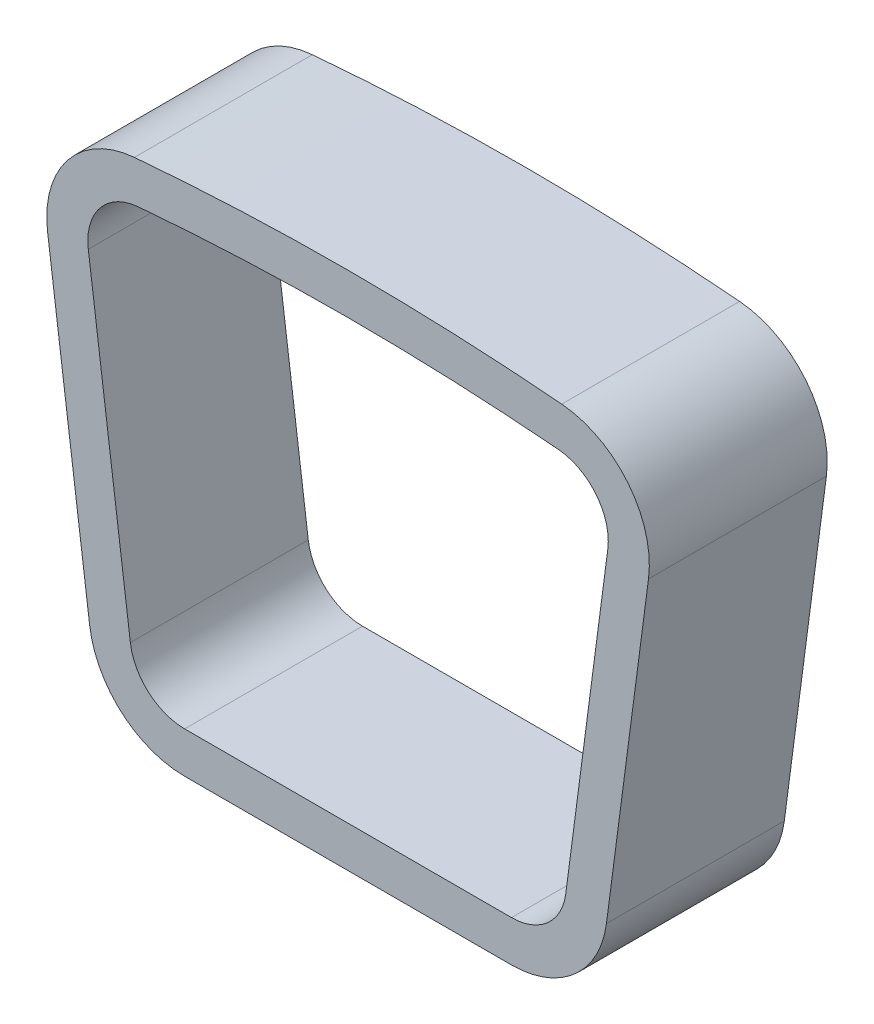
ISO-10303-21;
HEADER;
FILE_DESCRIPTION(('STEP AP214'),'2;1');
FILE_NAME('part.step','',(''),(''),'','','');
FILE_SCHEMA(('AUTOMOTIVE_DESIGN { 1 0 10303 214 1 1 1 1 }'));
ENDSEC;
DATA;
#1=APPLICATION_CONTEXT('core data for automotive mechanical design processes');
#2=APPLICATION_PROTOCOL_DEFINITION('international standard','automotive_design',2000,#1);
#3=PRODUCT_CONTEXT('',#1,'mechanical');
#4=PRODUCT('Part','Part','',(#3));
#5=PRODUCT_RELATED_PRODUCT_CATEGORY('part','',(#4));
#6=PRODUCT_DEFINITION_FORMATION('','',#4);
#7=PRODUCT_DEFINITION_CONTEXT('part definition',#1,'design');
#8=PRODUCT_DEFINITION('design','',#6,#7);
#9=PRODUCT_DEFINITION_SHAPE('','',#8);
#10=(LENGTH_UNIT() NAMED_UNIT(*) SI_UNIT(.MILLI.,.METRE.));
#11=(NAMED_UNIT(*) PLANE_ANGLE_UNIT() SI_UNIT($,.RADIAN.));
#12=(NAMED_UNIT(*) SI_UNIT($,.STERADIAN.) SOLID_ANGLE_UNIT());
#13=UNCERTAINTY_MEASURE_WITH_UNIT(LENGTH_MEASURE(1.E-05),#10,'distance_accuracy_value','');
#14=(GEOMETRIC_REPRESENTATION_CONTEXT(3) GLOBAL_UNCERTAINTY_ASSIGNED_CONTEXT((#13)) GLOBAL_UNIT_ASSIGNED_CONTEXT((#10,
#11,#12)) REPRESENTATION_CONTEXT('',''));
#15=CARTESIAN_POINT('',(0.,0.,0.));
#16=DIRECTION('',(0.,0.,1.));
#17=DIRECTION('',(1.,0.,0.));
#18=AXIS2_PLACEMENT_3D('',#15,#16,#17);
#19=CARTESIAN_POINT('',(-5.97107397432152,72.5,35.5819839661598));
#20=DIRECTION('',(0.,1.,0.));
#21=DIRECTION('',(-1.,0.,0.));
#22=AXIS2_PLACEMENT_3D('',#19,#20,#21);
#23=PLANE('',#22);
#24=DIRECTION('',(1.,0.,0.));
#25=VECTOR('',#24,1.);
#26=CARTESIAN_POINT('',(-5.97107397432152,72.5,6.49999999999999));
#27=LINE('',#26,#25);
#28=CARTESIAN_POINT('',(-5.97107397432152,72.5,6.5));
#29=VERTEX_POINT('',#28);
#30=CARTESIAN_POINT('',(5.97107397432167,72.5,6.49999999999999));
#31=VERTEX_POINT('',#30);
#32=EDGE_CURVE('E312',#29,#31,#27,.T.);
#33=ORIENTED_EDGE('',*,*,#32,.F.);
#34=DIRECTION('',(0.,0.,-1.));
#35=VECTOR('',#34,1.);
#36=CARTESIAN_POINT('',(-5.97107397432152,72.5,35.5819839661598));
#37=LINE('',#36,#35);
#38=CARTESIAN_POINT('',(-5.97107397432152,72.5,0.));
#39=VERTEX_POINT('',#38);
#40=EDGE_CURVE('E56',#29,#39,#37,.T.);
#41=ORIENTED_EDGE('',*,*,#40,.T.);
#42=DIRECTION('',(1.,0.,0.));
#43=VECTOR('',#42,1.);
#44=CARTESIAN_POINT('',(-5.97107397432152,72.5,0.));
#45=LINE('',#44,#43);
#46=CARTESIAN_POINT('',(5.97107397432167,72.5,0.));
#47=VERTEX_POINT('',#46);
#48=EDGE_CURVE('E207',#39,#47,#45,.T.);
#49=ORIENTED_EDGE('',*,*,#48,.T.);
#50=DIRECTION('',(0.,0.,-1.));
#51=VECTOR('',#50,1.);
#52=CARTESIAN_POINT('',(5.97107397432167,72.5,35.5819839661598));
#53=LINE('',#52,#51);
#54=EDGE_CURVE('E210',#31,#47,#53,.T.);
#55=ORIENTED_EDGE('',*,*,#54,.F.);
#56=EDGE_LOOP('',(#33,#41,#49,#55));
#57=FACE_BOUND('',#56,.T.);
#58=ADVANCED_FACE('F41',(#57),#23,.F.);
#59=CARTESIAN_POINT('',(-5.97107397432152,76.,35.5819839661598));
#60=DIRECTION('',(0.,0.,-1.));
#61=DIRECTION('',(-1.,0.,0.));
#62=AXIS2_PLACEMENT_3D('',#59,#60,#61);
#63=CYLINDRICAL_SURFACE('',#62,3.49999999999999);
#64=CARTESIAN_POINT('',(-5.97107397432152,76.,6.49999999999999));
#65=DIRECTION('',(0.,0.,1.));
#66=DIRECTION('',(1.,0.,0.));
#67=AXIS2_PLACEMENT_3D('',#64,#65,#66);
#68=CIRCLE('',#67,3.49999999999999);
#69=CARTESIAN_POINT('',(-9.44113098912984,75.5431583272298,6.5));
#70=VERTEX_POINT('',#69);
#71=EDGE_CURVE('E248',#70,#29,#68,.T.);
#72=ORIENTED_EDGE('',*,*,#71,.F.);
#73=DIRECTION('',(0.,0.,-1.));
#74=VECTOR('',#73,1.);
#75=CARTESIAN_POINT('',(-9.44113098912984,75.5431583272298,35.5819839661598));
#76=LINE('',#75,#74);
#77=CARTESIAN_POINT('',(-9.44113098912984,75.5431583272298,0.));
#78=VERTEX_POINT('',#77);
#79=EDGE_CURVE('E213',#70,#78,#76,.T.);
#80=ORIENTED_EDGE('',*,*,#79,.T.);
#81=CARTESIAN_POINT('',(-5.97107397432152,76.,0.));
#82=DIRECTION('',(0.,0.,1.));
#83=DIRECTION('',(1.,0.,0.));
#84=AXIS2_PLACEMENT_3D('',#81,#82,#83);
#85=CIRCLE('',#84,3.49999999999999);
#86=EDGE_CURVE('E205',#78,#39,#85,.T.);
#87=ORIENTED_EDGE('',*,*,#86,.T.);
#88=ORIENTED_EDGE('',*,*,#40,.F.);
#89=EDGE_LOOP('',(#72,#80,#87,#88));
#90=FACE_BOUND('',#89,.T.);
#91=ADVANCED_FACE('F245',(#90),#63,.T.);
#92=CARTESIAN_POINT('',(-10.978710331722,87.2222329423648,35.5819839661598));
#93=DIRECTION('',(0.99144486137381,0.130526192220056,0.));
#94=DIRECTION('',(-0.130526192220056,0.99144486137381,0.));
#95=AXIS2_PLACEMENT_3D('',#92,#93,#94);
#96=PLANE('',#95);
#97=DIRECTION('',(0.130526192220056,-0.99144486137381,0.));
#98=VECTOR('',#97,1.);
#99=CARTESIAN_POINT('',(-10.978710331722,87.2222329423648,6.49999999999999));
#100=LINE('',#99,#98);
#101=CARTESIAN_POINT('',(-10.978710331722,87.2222329423648,6.5));
#102=VERTEX_POINT('',#101);
#103=EDGE_CURVE('E253',#102,#70,#100,.T.);
#104=ORIENTED_EDGE('',*,*,#103,.F.);
#105=DIRECTION('',(0.,0.,-1.));
#106=VECTOR('',#105,1.);
#107=CARTESIAN_POINT('',(-10.978710331722,87.2222329423648,35.5819839661598));
#108=LINE('',#107,#106);
#109=CARTESIAN_POINT('',(-10.978710331722,87.2222329423648,0.));
#110=VERTEX_POINT('',#109);
#111=EDGE_CURVE('E215',#102,#110,#108,.T.);
#112=ORIENTED_EDGE('',*,*,#111,.T.);
#113=DIRECTION('',(0.130526192220056,-0.99144486137381,0.));
#114=VECTOR('',#113,1.);
#115=CARTESIAN_POINT('',(-10.978710331722,87.2222329423648,0.));
#116=LINE('',#115,#114);
#117=EDGE_CURVE('E202',#110,#78,#116,.T.);
#118=ORIENTED_EDGE('',*,*,#117,.T.);
#119=ORIENTED_EDGE('',*,*,#79,.F.);
#120=EDGE_LOOP('',(#104,#112,#118,#119));
#121=FACE_BOUND('',#120,.T.);
#122=ADVANCED_FACE('F251',(#121),#96,.F.);
#123=CARTESIAN_POINT('',(-7.50865331691368,87.679074615135,35.5819839661598));
#124=DIRECTION('',(0.,0.,-1.));
#125=DIRECTION('',(-1.,0.,0.));
#126=AXIS2_PLACEMENT_3D('',#123,#124,#125);
#127=CYLINDRICAL_SURFACE('',#126,3.49999999999998);
#128=CARTESIAN_POINT('',(-7.50865331691368,87.679074615135,6.49999999999999));
#129=DIRECTION('',(0.,0.,1.));
#130=DIRECTION('',(1.,0.,0.));
#131=AXIS2_PLACEMENT_3D('',#128,#129,#130);
#132=CIRCLE('',#131,3.49999999999998);
#133=CARTESIAN_POINT('',(-7.80729293747274,91.1663105373278,6.5));
#134=VERTEX_POINT('',#133);
#135=EDGE_CURVE('E316',#134,#102,#132,.T.);
#136=ORIENTED_EDGE('',*,*,#135,.F.);
#137=DIRECTION('',(0.,0.,-1.));
#138=VECTOR('',#137,1.);
#139=CARTESIAN_POINT('',(-7.80729293747274,91.1663105373278,35.5819839661598));
#140=LINE('',#139,#138);
#141=CARTESIAN_POINT('',(-7.80729293747274,91.1663105373278,0.));
#142=VERTEX_POINT('',#141);
#143=EDGE_CURVE('E217',#134,#142,#140,.T.);
#144=ORIENTED_EDGE('',*,*,#143,.T.);
#145=CARTESIAN_POINT('',(-7.50865331691368,87.679074615135,0.));
#146=DIRECTION('',(0.,0.,1.));
#147=DIRECTION('',(1.,0.,0.));
#148=AXIS2_PLACEMENT_3D('',#145,#146,#147);
#149=CIRCLE('',#148,3.49999999999998);
#150=EDGE_CURVE('E199',#142,#110,#149,.T.);
#151=ORIENTED_EDGE('',*,*,#150,.T.);
#152=ORIENTED_EDGE('',*,*,#111,.F.);
#153=EDGE_LOOP('',(#136,#144,#151,#152));
#154=FACE_BOUND('',#153,.T.);
#155=ADVANCED_FACE('F256',(#154),#127,.T.);
#156=CARTESIAN_POINT('',(0.,0.,35.5819839661598));
#157=DIRECTION('',(0.,0.,-1.));
#158=DIRECTION('',(-1.,0.,0.));
#159=AXIS2_PLACEMENT_3D('',#156,#157,#158);
#160=CYLINDRICAL_SURFACE('',#159,91.5);
#161=CARTESIAN_POINT('',(0.,0.,6.49999999999999));
#162=DIRECTION('',(0.,0.,1.));
#163=DIRECTION('',(1.,0.,0.));
#164=AXIS2_PLACEMENT_3D('',#161,#162,#163);
#165=CIRCLE('',#164,91.5);
#166=CARTESIAN_POINT('',(7.80729293747267,91.1663105373278,6.5));
#167=VERTEX_POINT('',#166);
#168=EDGE_CURVE('E262',#167,#134,#165,.T.);
#169=ORIENTED_EDGE('',*,*,#168,.F.);
#170=DIRECTION('',(0.,0.,-1.));
#171=VECTOR('',#170,1.);
#172=CARTESIAN_POINT('',(7.80729293747267,91.1663105373278,35.5819839661598));
#173=LINE('',#172,#171);
#174=CARTESIAN_POINT('',(7.80729293747267,91.1663105373278,0.));
#175=VERTEX_POINT('',#174);
#176=EDGE_CURVE('E219',#167,#175,#173,.T.);
#177=ORIENTED_EDGE('',*,*,#176,.T.);
#178=CARTESIAN_POINT('',(0.,0.,0.));
#179=DIRECTION('',(0.,0.,1.));
#180=DIRECTION('',(1.,0.,0.));
#181=AXIS2_PLACEMENT_3D('',#178,#179,#180);
#182=CIRCLE('',#181,91.5);
#183=EDGE_CURVE('E196',#175,#142,#182,.T.);
#184=ORIENTED_EDGE('',*,*,#183,.T.);
#185=ORIENTED_EDGE('',*,*,#143,.F.);
#186=EDGE_LOOP('',(#169,#177,#184,#185));
#187=FACE_BOUND('',#186,.T.);
#188=ADVANCED_FACE('F259',(#187),#160,.T.);
#189=CARTESIAN_POINT('',(7.5086533169136,87.679074615135,35.5819839661598));
#190=DIRECTION('',(0.,0.,-1.));
#191=DIRECTION('',(-1.,0.,0.));
#192=AXIS2_PLACEMENT_3D('',#189,#190,#191);
#193=CYLINDRICAL_SURFACE('',#192,3.49999999999998);
#194=CARTESIAN_POINT('',(7.5086533169136,87.679074615135,6.49999999999999));
#195=DIRECTION('',(0.,0.,1.));
#196=DIRECTION('',(1.,0.,0.));
#197=AXIS2_PLACEMENT_3D('',#194,#195,#196);
#198=CIRCLE('',#197,3.49999999999998);
#199=CARTESIAN_POINT('',(10.9787103317219,87.2222329423648,6.5));
#200=VERTEX_POINT('',#199);
#201=EDGE_CURVE('E266',#200,#167,#198,.T.);
#202=ORIENTED_EDGE('',*,*,#201,.F.);
#203=DIRECTION('',(0.,0.,-1.));
#204=VECTOR('',#203,1.);
#205=CARTESIAN_POINT('',(10.9787103317219,87.2222329423648,35.5819839661598));
#206=LINE('',#205,#204);
#207=CARTESIAN_POINT('',(10.9787103317219,87.2222329423648,0.));
#208=VERTEX_POINT('',#207);
#209=EDGE_CURVE('E221',#200,#208,#206,.T.);
#210=ORIENTED_EDGE('',*,*,#209,.T.);
#211=CARTESIAN_POINT('',(7.5086533169136,87.679074615135,0.));
#212=DIRECTION('',(0.,0.,1.));
#213=DIRECTION('',(1.,0.,0.));
#214=AXIS2_PLACEMENT_3D('',#211,#212,#213);
#215=CIRCLE('',#214,3.49999999999998);
#216=EDGE_CURVE('E193',#208,#175,#215,.T.);
#217=ORIENTED_EDGE('',*,*,#216,.T.);
#218=ORIENTED_EDGE('',*,*,#176,.F.);
#219=EDGE_LOOP('',(#202,#210,#217,#218));
#220=FACE_BOUND('',#219,.T.);
#221=ADVANCED_FACE('F265',(#220),#193,.T.);
#222=CARTESIAN_POINT('',(9.44113098912986,75.5431583272299,35.5819839661598));
#223=DIRECTION('',(-0.99144486137381,0.130526192220051,0.));
#224=DIRECTION('',(-0.130526192220051,-0.991444861373811,0.));
#225=AXIS2_PLACEMENT_3D('',#222,#223,#224);
#226=PLANE('',#225);
#227=DIRECTION('',(0.130526192220051,0.991444861373811,0.));
#228=VECTOR('',#227,1.);
#229=CARTESIAN_POINT('',(9.44113098912986,75.5431583272299,6.49999999999999));
#230=LINE('',#229,#228);
#231=CARTESIAN_POINT('',(9.44113098912986,75.5431583272299,6.5));
#232=VERTEX_POINT('',#231);
#233=EDGE_CURVE('E229',#232,#200,#230,.T.);
#234=ORIENTED_EDGE('',*,*,#233,.F.);
#235=DIRECTION('',(0.,0.,-1.));
#236=VECTOR('',#235,1.);
#237=CARTESIAN_POINT('',(9.44113098912986,75.5431583272299,35.5819839661598));
#238=LINE('',#237,#236);
#239=CARTESIAN_POINT('',(9.44113098912986,75.5431583272299,0.));
#240=VERTEX_POINT('',#239);
#241=EDGE_CURVE('E49',#232,#240,#238,.T.);
#242=ORIENTED_EDGE('',*,*,#241,.T.);
#243=DIRECTION('',(0.130526192220051,0.99144486137381,0.));
#244=VECTOR('',#243,1.);
#245=CARTESIAN_POINT('',(9.44113098912986,75.5431583272299,0.));
#246=LINE('',#245,#244);
#247=EDGE_CURVE('E190',#240,#208,#246,.T.);
#248=ORIENTED_EDGE('',*,*,#247,.T.);
#249=ORIENTED_EDGE('',*,*,#209,.F.);
#250=EDGE_LOOP('',(#234,#242,#248,#249));
#251=FACE_BOUND('',#250,.T.);
#252=ADVANCED_FACE('F225',(#251),#226,.F.);
#253=CARTESIAN_POINT('',(5.97107397432167,76.,35.5819839661598));
#254=DIRECTION('',(0.,0.,-1.));
#255=DIRECTION('',(-1.,0.,0.));
#256=AXIS2_PLACEMENT_3D('',#253,#254,#255);
#257=CYLINDRICAL_SURFACE('',#256,3.49999999999993);
#258=CARTESIAN_POINT('',(5.97107397432167,76.,6.49999999999999));
#259=DIRECTION('',(0.,0.,1.));
#260=DIRECTION('',(1.,0.,0.));
#261=AXIS2_PLACEMENT_3D('',#258,#259,#260);
#262=CIRCLE('',#261,3.49999999999993);
#263=EDGE_CURVE('E239',#31,#232,#262,.T.);
#264=ORIENTED_EDGE('',*,*,#263,.F.);
#265=ORIENTED_EDGE('',*,*,#54,.T.);
#266=CARTESIAN_POINT('',(5.97107397432167,76.,0.));
#267=DIRECTION('',(0.,0.,1.));
#268=DIRECTION('',(1.,0.,0.));
#269=AXIS2_PLACEMENT_3D('',#266,#267,#268);
#270=CIRCLE('',#269,3.49999999999993);
#271=EDGE_CURVE('E187',#47,#240,#270,.T.);
#272=ORIENTED_EDGE('',*,*,#271,.T.);
#273=ORIENTED_EDGE('',*,*,#241,.F.);
#274=EDGE_LOOP('',(#264,#265,#272,#273));
#275=FACE_BOUND('',#274,.T.);
#276=ADVANCED_FACE('F43',(#275),#257,.T.);
#277=CARTESIAN_POINT('',(5.97107397432167,76.,0.));
#278=DIRECTION('',(0.,0.,1.));
#279=DIRECTION('',(1.,0.,0.));
#280=AXIS2_PLACEMENT_3D('',#277,#278,#279);
#281=PLANE('',#280);
#282=ORIENTED_EDGE('',*,*,#271,.F.);
#283=ORIENTED_EDGE('',*,*,#48,.F.);
#284=ORIENTED_EDGE('',*,*,#86,.F.);
#285=ORIENTED_EDGE('',*,*,#117,.F.);
#286=ORIENTED_EDGE('',*,*,#150,.F.);
#287=ORIENTED_EDGE('',*,*,#183,.F.);
#288=ORIENTED_EDGE('',*,*,#216,.F.);
#289=ORIENTED_EDGE('',*,*,#247,.F.);
#290=EDGE_LOOP('',(#282,#283,#284,#285,#286,#287,#288,#289));
#291=FACE_BOUND('',#290,.T.);
#292=CARTESIAN_POINT('',(7.5086533169136,87.679074615135,0.));
#293=DIRECTION('',(0.,0.,1.));
#294=DIRECTION('',(1.,0.,0.));
#295=AXIS2_PLACEMENT_3D('',#292,#293,#294);
#296=CIRCLE('',#295,1.99999999999999);
#297=CARTESIAN_POINT('',(9.4915430396612,87.4180222306949,0.));
#298=VERTEX_POINT('',#297);
#299=CARTESIAN_POINT('',(7.67930452866165,89.6717808563881,0.));
#300=VERTEX_POINT('',#299);
#301=EDGE_CURVE('E268',#298,#300,#296,.T.);
#302=ORIENTED_EDGE('',*,*,#301,.T.);
#303=CARTESIAN_POINT('',(0.,0.,0.));
#304=DIRECTION('',(0.,0.,1.));
#305=DIRECTION('',(1.,0.,0.));
#306=AXIS2_PLACEMENT_3D('',#303,#304,#305);
#307=CIRCLE('',#306,90.);
#308=CARTESIAN_POINT('',(-7.67930452866172,89.671780856388,0.));
#309=VERTEX_POINT('',#308);
#310=EDGE_CURVE('E275',#300,#309,#307,.T.);
#311=ORIENTED_EDGE('',*,*,#310,.T.);
#312=CARTESIAN_POINT('',(-7.50865331691368,87.679074615135,0.));
#313=DIRECTION('',(0.,0.,1.));
#314=DIRECTION('',(1.,0.,0.));
#315=AXIS2_PLACEMENT_3D('',#312,#313,#314);
#316=CIRCLE('',#315,1.99999999999998);
#317=CARTESIAN_POINT('',(-9.49154303966128,87.4180222306949,0.));
#318=VERTEX_POINT('',#317);
#319=EDGE_CURVE('E278',#309,#318,#316,.T.);
#320=ORIENTED_EDGE('',*,*,#319,.T.);
#321=DIRECTION('',(0.130526192220056,-0.99144486137381,0.));
#322=VECTOR('',#321,1.);
#323=CARTESIAN_POINT('',(-9.49154303966125,87.4180222306949,0.));
#324=LINE('',#323,#322);
#325=CARTESIAN_POINT('',(-7.95396369706912,75.7389476155599,0.));
#326=VERTEX_POINT('',#325);
#327=EDGE_CURVE('E281',#318,#326,#324,.T.);
#328=ORIENTED_EDGE('',*,*,#327,.T.);
#329=CARTESIAN_POINT('',(-5.97107397432152,76.,0.));
#330=DIRECTION('',(0.,0.,1.));
#331=DIRECTION('',(1.,0.,0.));
#332=AXIS2_PLACEMENT_3D('',#329,#330,#331);
#333=CIRCLE('',#332,1.99999999999998);
#334=CARTESIAN_POINT('',(-5.97107397432152,74.,0.));
#335=VERTEX_POINT('',#334);
#336=EDGE_CURVE('E284',#326,#335,#333,.T.);
#337=ORIENTED_EDGE('',*,*,#336,.T.);
#338=DIRECTION('',(1.,0.,0.));
#339=VECTOR('',#338,1.);
#340=CARTESIAN_POINT('',(-5.97107397432152,74.,0.));
#341=LINE('',#340,#339);
#342=CARTESIAN_POINT('',(5.97107397432167,74.,0.));
#343=VERTEX_POINT('',#342);
#344=EDGE_CURVE('E287',#335,#343,#341,.T.);
#345=ORIENTED_EDGE('',*,*,#344,.T.);
#346=CARTESIAN_POINT('',(5.97107397432167,76.,0.));
#347=DIRECTION('',(0.,0.,1.));
#348=DIRECTION('',(1.,0.,0.));
#349=AXIS2_PLACEMENT_3D('',#346,#347,#348);
#350=CIRCLE('',#349,1.99999999999996);
#351=CARTESIAN_POINT('',(7.95396369706925,75.7389476155599,0.));
#352=VERTEX_POINT('',#351);
#353=EDGE_CURVE('E290',#343,#352,#350,.T.);
#354=ORIENTED_EDGE('',*,*,#353,.T.);
#355=DIRECTION('',(0.130526192220045,0.991444861373811,0.));
#356=VECTOR('',#355,1.);
#357=CARTESIAN_POINT('',(7.95396369706922,75.7389476155599,0.));
#358=LINE('',#357,#356);
#359=EDGE_CURVE('E169',#352,#298,#358,.T.);
#360=ORIENTED_EDGE('',*,*,#359,.T.);
#361=EDGE_LOOP('',(#302,#311,#320,#328,#337,#345,#354,#360));
#362=FACE_BOUND('',#361,.T.);
#363=ADVANCED_FACE('F235',(#291,#362),#281,.F.);
#364=CARTESIAN_POINT('',(7.95396369706922,75.7389476155599,35.5819839661598));
#365=DIRECTION('',(-0.991444861373811,0.130526192220045,0.));
#366=DIRECTION('',(-0.130526192220045,-0.991444861373811,0.));
#367=AXIS2_PLACEMENT_3D('',#364,#365,#366);
#368=PLANE('',#367);
#369=DIRECTION('',(0.,0.,-1.));
#370=VECTOR('',#369,1.);
#371=CARTESIAN_POINT('',(7.95396369706925,75.7389476155599,35.5819839661598));
#372=LINE('',#371,#370);
#373=CARTESIAN_POINT('',(7.95396369706922,75.7389476155599,6.49999999999999));
#374=VERTEX_POINT('',#373);
#375=EDGE_CURVE('E161',#374,#352,#372,.T.);
#376=ORIENTED_EDGE('',*,*,#375,.F.);
#377=DIRECTION('',(0.130526192220045,0.991444861373811,0.));
#378=VECTOR('',#377,1.);
#379=CARTESIAN_POINT('',(7.95396369706922,75.7389476155599,6.49999999999999));
#380=LINE('',#379,#378);
#381=CARTESIAN_POINT('',(9.4915430396612,87.4180222306949,6.5));
#382=VERTEX_POINT('',#381);
#383=EDGE_CURVE('E11',#374,#382,#380,.T.);
#384=ORIENTED_EDGE('',*,*,#383,.T.);
#385=DIRECTION('',(0.,0.,-1.));
#386=VECTOR('',#385,1.);
#387=CARTESIAN_POINT('',(9.4915430396612,87.4180222306949,35.5819839661598));
#388=LINE('',#387,#386);
#389=EDGE_CURVE('E171',#382,#298,#388,.T.);
#390=ORIENTED_EDGE('',*,*,#389,.T.);
#391=ORIENTED_EDGE('',*,*,#359,.F.);
#392=EDGE_LOOP('',(#376,#384,#390,#391));
#393=FACE_BOUND('',#392,.T.);
#394=ADVANCED_FACE('F167',(#393),#368,.T.);
#395=CARTESIAN_POINT('',(5.97107397432167,76.,35.5819839661598));
#396=DIRECTION('',(0.,0.,-1.));
#397=DIRECTION('',(-1.,0.,0.));
#398=AXIS2_PLACEMENT_3D('',#395,#396,#397);
#399=CYLINDRICAL_SURFACE('',#398,1.99999999999996);
#400=DIRECTION('',(0.,0.,-1.));
#401=VECTOR('',#400,1.);
#402=CARTESIAN_POINT('',(5.97107397432167,74.,35.5819839661598));
#403=LINE('',#402,#401);
#404=CARTESIAN_POINT('',(5.97107397432167,74.0000000000001,6.49999999999999));
#405=VERTEX_POINT('',#404);
#406=EDGE_CURVE('E163',#405,#343,#403,.T.);
#407=ORIENTED_EDGE('',*,*,#406,.F.);
#408=CARTESIAN_POINT('',(5.97107397432167,76.,6.49999999999999));
#409=DIRECTION('',(0.,0.,1.));
#410=DIRECTION('',(1.,0.,0.));
#411=AXIS2_PLACEMENT_3D('',#408,#409,#410);
#412=CIRCLE('',#411,1.99999999999996);
#413=EDGE_CURVE('E154',#405,#374,#412,.T.);
#414=ORIENTED_EDGE('',*,*,#413,.T.);
#415=ORIENTED_EDGE('',*,*,#375,.T.);
#416=ORIENTED_EDGE('',*,*,#353,.F.);
#417=EDGE_LOOP('',(#407,#414,#415,#416));
#418=FACE_BOUND('',#417,.T.);
#419=ADVANCED_FACE('F159',(#418),#399,.F.);
#420=CARTESIAN_POINT('',(-5.97107397432152,74.,35.5819839661598));
#421=DIRECTION('',(0.,1.,0.));
#422=DIRECTION('',(-1.,0.,0.));
#423=AXIS2_PLACEMENT_3D('',#420,#421,#422);
#424=PLANE('',#423);
#425=DIRECTION('',(0.,0.,-1.));
#426=VECTOR('',#425,1.);
#427=CARTESIAN_POINT('',(-5.97107397432152,74.,35.5819839661598));
#428=LINE('',#427,#426);
#429=CARTESIAN_POINT('',(-5.97107397432152,74.,6.49999999999999));
#430=VERTEX_POINT('',#429);
#431=EDGE_CURVE('E173',#430,#335,#428,.T.);
#432=ORIENTED_EDGE('',*,*,#431,.F.);
#433=DIRECTION('',(1.,0.,0.));
#434=VECTOR('',#433,1.);
#435=CARTESIAN_POINT('',(-5.97107397432152,74.,6.49999999999999));
#436=LINE('',#435,#434);
#437=EDGE_CURVE('E165',#430,#405,#436,.T.);
#438=ORIENTED_EDGE('',*,*,#437,.T.);
#439=ORIENTED_EDGE('',*,*,#406,.T.);
#440=ORIENTED_EDGE('',*,*,#344,.F.);
#441=EDGE_LOOP('',(#432,#438,#439,#440));
#442=FACE_BOUND('',#441,.T.);
#443=ADVANCED_FACE('F296',(#442),#424,.T.);
#444=CARTESIAN_POINT('',(-5.97107397432152,76.,35.5819839661598));
#445=DIRECTION('',(0.,0.,-1.));
#446=DIRECTION('',(-1.,0.,0.));
#447=AXIS2_PLACEMENT_3D('',#444,#445,#446);
#448=CYLINDRICAL_SURFACE('',#447,1.99999999999998);
#449=DIRECTION('',(0.,0.,-1.));
#450=VECTOR('',#449,1.);
#451=CARTESIAN_POINT('',(-7.95396369706912,75.7389476155599,35.5819839661598));
#452=LINE('',#451,#450);
#453=CARTESIAN_POINT('',(-7.95396369706912,75.7389476155599,6.49999999999999));
#454=VERTEX_POINT('',#453);
#455=EDGE_CURVE('E179',#454,#326,#452,.T.);
#456=ORIENTED_EDGE('',*,*,#455,.F.);
#457=CARTESIAN_POINT('',(-5.97107397432152,76.,6.49999999999999));
#458=DIRECTION('',(0.,0.,1.));
#459=DIRECTION('',(1.,0.,0.));
#460=AXIS2_PLACEMENT_3D('',#457,#458,#459);
#461=CIRCLE('',#460,1.99999999999998);
#462=EDGE_CURVE('E298',#454,#430,#461,.T.);
#463=ORIENTED_EDGE('',*,*,#462,.T.);
#464=ORIENTED_EDGE('',*,*,#431,.T.);
#465=ORIENTED_EDGE('',*,*,#336,.F.);
#466=EDGE_LOOP('',(#456,#463,#464,#465));
#467=FACE_BOUND('',#466,.T.);
#468=ADVANCED_FACE('F333',(#467),#448,.F.);
#469=CARTESIAN_POINT('',(-9.49154303966125,87.4180222306949,35.5819839661598));
#470=DIRECTION('',(0.99144486137381,0.130526192220056,0.));
#471=DIRECTION('',(-0.130526192220056,0.99144486137381,0.));
#472=AXIS2_PLACEMENT_3D('',#469,#470,#471);
#473=PLANE('',#472);
#474=DIRECTION('',(0.,0.,-1.));
#475=VECTOR('',#474,1.);
#476=CARTESIAN_POINT('',(-9.49154303966128,87.4180222306949,35.5819839661598));
#477=LINE('',#476,#475);
#478=CARTESIAN_POINT('',(-9.49154303966125,87.4180222306949,6.49999999999999));
#479=VERTEX_POINT('',#478);
#480=EDGE_CURVE('E181',#479,#318,#477,.T.);
#481=ORIENTED_EDGE('',*,*,#480,.F.);
#482=DIRECTION('',(0.130526192220056,-0.99144486137381,0.));
#483=VECTOR('',#482,1.);
#484=CARTESIAN_POINT('',(-9.49154303966125,87.4180222306949,6.49999999999999));
#485=LINE('',#484,#483);
#486=EDGE_CURVE('E300',#479,#454,#485,.T.);
#487=ORIENTED_EDGE('',*,*,#486,.T.);
#488=ORIENTED_EDGE('',*,*,#455,.T.);
#489=ORIENTED_EDGE('',*,*,#327,.F.);
#490=EDGE_LOOP('',(#481,#487,#488,#489));
#491=FACE_BOUND('',#490,.T.);
#492=ADVANCED_FACE('F330',(#491),#473,.T.);
#493=CARTESIAN_POINT('',(-7.50865331691368,87.679074615135,35.5819839661598));
#494=DIRECTION('',(0.,0.,-1.));
#495=DIRECTION('',(-1.,0.,0.));
#496=AXIS2_PLACEMENT_3D('',#493,#494,#495);
#497=CYLINDRICAL_SURFACE('',#496,1.99999999999998);
#498=DIRECTION('',(0.,0.,-1.));
#499=VECTOR('',#498,1.);
#500=CARTESIAN_POINT('',(-7.67930452866172,89.671780856388,35.5819839661598));
#501=LINE('',#500,#499);
#502=CARTESIAN_POINT('',(-7.67930452866171,89.671780856388,6.49999999999999));
#503=VERTEX_POINT('',#502);
#504=EDGE_CURVE('E183',#503,#309,#501,.T.);
#505=ORIENTED_EDGE('',*,*,#504,.F.);
#506=CARTESIAN_POINT('',(-7.50865331691368,87.679074615135,6.49999999999999));
#507=DIRECTION('',(0.,0.,1.));
#508=DIRECTION('',(1.,0.,0.));
#509=AXIS2_PLACEMENT_3D('',#506,#507,#508);
#510=CIRCLE('',#509,1.99999999999998);
#511=EDGE_CURVE('E305',#503,#479,#510,.T.);
#512=ORIENTED_EDGE('',*,*,#511,.T.);
#513=ORIENTED_EDGE('',*,*,#480,.T.);
#514=ORIENTED_EDGE('',*,*,#319,.F.);
#515=EDGE_LOOP('',(#505,#512,#513,#514));
#516=FACE_BOUND('',#515,.T.);
#517=ADVANCED_FACE('F327',(#516),#497,.F.);
#518=CARTESIAN_POINT('',(0.,0.,35.5819839661598));
#519=DIRECTION('',(0.,0.,-1.));
#520=DIRECTION('',(-1.,0.,0.));
#521=AXIS2_PLACEMENT_3D('',#518,#519,#520);
#522=CYLINDRICAL_SURFACE('',#521,90.);
#523=DIRECTION('',(0.,0.,-1.));
#524=VECTOR('',#523,1.);
#525=CARTESIAN_POINT('',(7.67930452866165,89.6717808563881,35.5819839661598));
#526=LINE('',#525,#524);
#527=CARTESIAN_POINT('',(7.67930452866165,89.6717808563881,6.49999999999999));
#528=VERTEX_POINT('',#527);
#529=EDGE_CURVE('E185',#528,#300,#526,.T.);
#530=ORIENTED_EDGE('',*,*,#529,.F.);
#531=CARTESIAN_POINT('',(0.,0.,6.49999999999999));
#532=DIRECTION('',(0.,0.,1.));
#533=DIRECTION('',(1.,0.,0.));
#534=AXIS2_PLACEMENT_3D('',#531,#532,#533);
#535=CIRCLE('',#534,90.);
#536=EDGE_CURVE('E308',#528,#503,#535,.T.);
#537=ORIENTED_EDGE('',*,*,#536,.T.);
#538=ORIENTED_EDGE('',*,*,#504,.T.);
#539=ORIENTED_EDGE('',*,*,#310,.F.);
#540=EDGE_LOOP('',(#530,#537,#538,#539));
#541=FACE_BOUND('',#540,.T.);
#542=ADVANCED_FACE('F322',(#541),#522,.F.);
#543=CARTESIAN_POINT('',(7.5086533169136,87.679074615135,35.5819839661598));
#544=DIRECTION('',(0.,0.,-1.));
#545=DIRECTION('',(-1.,0.,0.));
#546=AXIS2_PLACEMENT_3D('',#543,#544,#545);
#547=CYLINDRICAL_SURFACE('',#546,1.99999999999999);
#548=ORIENTED_EDGE('',*,*,#389,.F.);
#549=CARTESIAN_POINT('',(7.5086533169136,87.679074615135,6.49999999999999));
#550=DIRECTION('',(0.,0.,1.));
#551=DIRECTION('',(1.,0.,0.));
#552=AXIS2_PLACEMENT_3D('',#549,#550,#551);
#553=CIRCLE('',#552,1.99999999999999);
#554=EDGE_CURVE('E64',#382,#528,#553,.T.);
#555=ORIENTED_EDGE('',*,*,#554,.T.);
#556=ORIENTED_EDGE('',*,*,#529,.T.);
#557=ORIENTED_EDGE('',*,*,#301,.F.);
#558=EDGE_LOOP('',(#548,#555,#556,#557));
#559=FACE_BOUND('',#558,.T.);
#560=ADVANCED_FACE('F318',(#559),#547,.F.);
#561=CARTESIAN_POINT('',(0.,0.,6.49999999999999));
#562=DIRECTION('',(0.,0.,1.));
#563=DIRECTION('',(1.,0.,0.));
#564=AXIS2_PLACEMENT_3D('',#561,#562,#563);
#565=PLANE('',#564);
#566=ORIENTED_EDGE('',*,*,#554,.F.);
#567=ORIENTED_EDGE('',*,*,#383,.F.);
#568=ORIENTED_EDGE('',*,*,#413,.F.);
#569=ORIENTED_EDGE('',*,*,#437,.F.);
#570=ORIENTED_EDGE('',*,*,#462,.F.);
#571=ORIENTED_EDGE('',*,*,#486,.F.);
#572=ORIENTED_EDGE('',*,*,#511,.F.);
#573=ORIENTED_EDGE('',*,*,#536,.F.);
#574=EDGE_LOOP('',(#566,#567,#568,#569,#570,#571,#572,#573));
#575=FACE_BOUND('',#574,.T.);
#576=ORIENTED_EDGE('',*,*,#32,.T.);
#577=ORIENTED_EDGE('',*,*,#263,.T.);
#578=ORIENTED_EDGE('',*,*,#233,.T.);
#579=ORIENTED_EDGE('',*,*,#201,.T.);
#580=ORIENTED_EDGE('',*,*,#168,.T.);
#581=ORIENTED_EDGE('',*,*,#135,.T.);
#582=ORIENTED_EDGE('',*,*,#103,.T.);
#583=ORIENTED_EDGE('',*,*,#71,.T.);
#584=EDGE_LOOP('',(#576,#577,#578,#579,#580,#581,#582,#583));
#585=FACE_BOUND('',#584,.T.);
#586=ADVANCED_FACE('F152',(#575,#585),#565,.T.);
#587=CLOSED_SHELL('',(#58,#91,#122,#155,#188,#221,#252,#276,#363,#394,#419,#443,#468,#492,#517,
#542,#560,#586));
#588=MANIFOLD_SOLID_BREP('B2',#587);
#589=ADVANCED_BREP_SHAPE_REPRESENTATION('',(#18,#588),#14);
#590=SHAPE_DEFINITION_REPRESENTATION(#9,#589);
ENDSEC;
END-ISO-10303-21;
